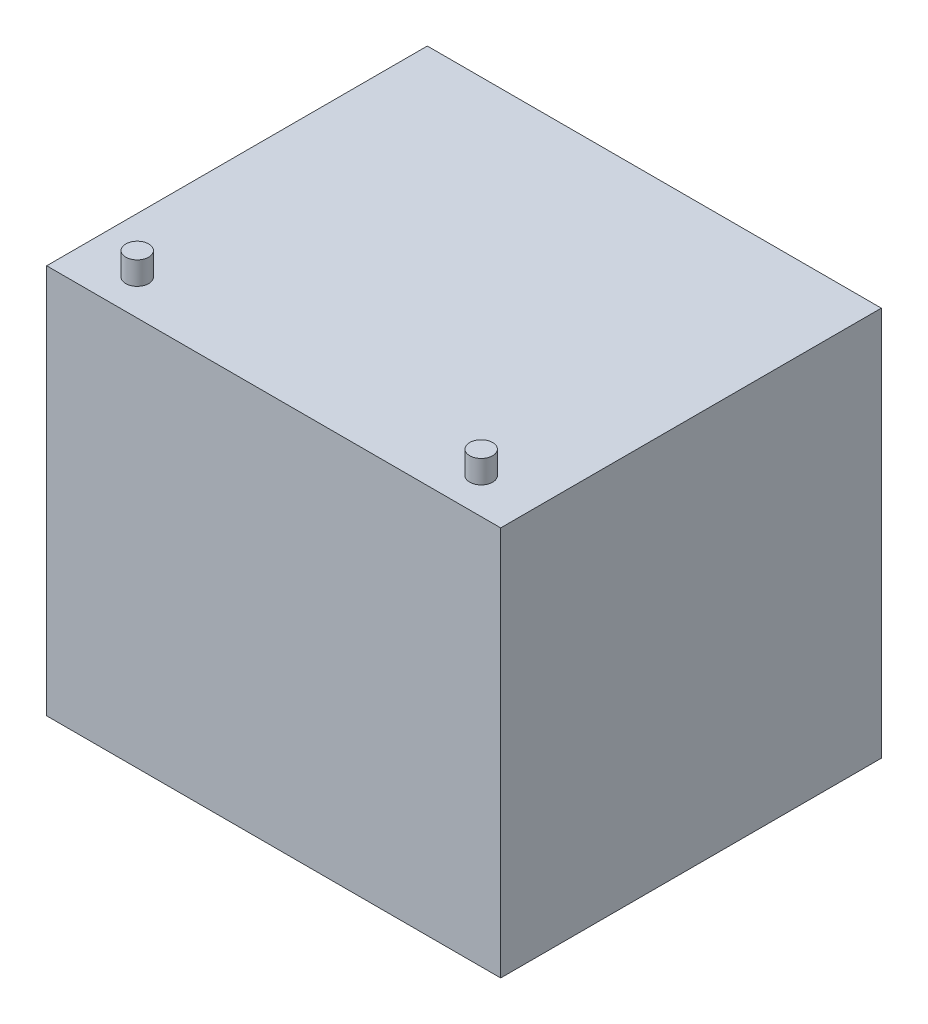
ISO-10303-21;
HEADER;
FILE_DESCRIPTION(('STEP AP214'),'2;1');
FILE_NAME('part.step','',(''),(''),'','','');
FILE_SCHEMA(('AUTOMOTIVE_DESIGN { 1 0 10303 214 1 1 1 1 }'));
ENDSEC;
DATA;
#1=APPLICATION_CONTEXT('core data for automotive mechanical design processes');
#2=APPLICATION_PROTOCOL_DEFINITION('international standard','automotive_design',2000,#1);
#3=PRODUCT_CONTEXT('',#1,'mechanical');
#4=PRODUCT('Part','Part','',(#3));
#5=PRODUCT_RELATED_PRODUCT_CATEGORY('part','',(#4));
#6=PRODUCT_DEFINITION_FORMATION('','',#4);
#7=PRODUCT_DEFINITION_CONTEXT('part definition',#1,'design');
#8=PRODUCT_DEFINITION('design','',#6,#7);
#9=PRODUCT_DEFINITION_SHAPE('','',#8);
#10=(LENGTH_UNIT() NAMED_UNIT(*) SI_UNIT(.MILLI.,.METRE.));
#11=(NAMED_UNIT(*) PLANE_ANGLE_UNIT() SI_UNIT($,.RADIAN.));
#12=(NAMED_UNIT(*) SI_UNIT($,.STERADIAN.) SOLID_ANGLE_UNIT());
#13=UNCERTAINTY_MEASURE_WITH_UNIT(LENGTH_MEASURE(1.E-05),#10,'distance_accuracy_value','');
#14=(GEOMETRIC_REPRESENTATION_CONTEXT(3) GLOBAL_UNCERTAINTY_ASSIGNED_CONTEXT((#13)) GLOBAL_UNIT_ASSIGNED_CONTEXT((#10,
#11,#12)) REPRESENTATION_CONTEXT('',''));
#15=CARTESIAN_POINT('',(0.,0.,0.));
#16=DIRECTION('',(0.,0.,1.));
#17=DIRECTION('',(1.,0.,0.));
#18=AXIS2_PLACEMENT_3D('',#15,#16,#17);
#19=CARTESIAN_POINT('',(99.,170.,-83.));
#20=DIRECTION('',(-1.,0.,0.));
#21=DIRECTION('',(0.,0.,1.));
#22=AXIS2_PLACEMENT_3D('',#19,#20,#21);
#23=PLANE('',#22);
#24=DIRECTION('',(0.,0.,-1.));
#25=VECTOR('',#24,1.);
#26=CARTESIAN_POINT('',(99.,0.,-83.));
#27=LINE('',#26,#25);
#28=CARTESIAN_POINT('',(99.,0.,83.));
#29=VERTEX_POINT('',#28);
#30=CARTESIAN_POINT('',(99.,0.,-83.));
#31=VERTEX_POINT('',#30);
#32=EDGE_CURVE('E103',#29,#31,#27,.T.);
#33=ORIENTED_EDGE('',*,*,#32,.T.);
#34=DIRECTION('',(0.,-1.,0.));
#35=VECTOR('',#34,1.);
#36=CARTESIAN_POINT('',(99.,170.,-83.));
#37=LINE('',#36,#35);
#38=CARTESIAN_POINT('',(99.,170.,-83.));
#39=VERTEX_POINT('',#38);
#40=EDGE_CURVE('E11',#39,#31,#37,.T.);
#41=ORIENTED_EDGE('',*,*,#40,.F.);
#42=DIRECTION('',(0.,0.,-1.));
#43=VECTOR('',#42,1.);
#44=CARTESIAN_POINT('',(99.,170.,-83.));
#45=LINE('',#44,#43);
#46=CARTESIAN_POINT('',(99.,170.,83.));
#47=VERTEX_POINT('',#46);
#48=EDGE_CURVE('E91',#47,#39,#45,.T.);
#49=ORIENTED_EDGE('',*,*,#48,.F.);
#50=DIRECTION('',(0.,-1.,0.));
#51=VECTOR('',#50,1.);
#52=CARTESIAN_POINT('',(99.,170.,83.));
#53=LINE('',#52,#51);
#54=EDGE_CURVE('E99',#47,#29,#53,.T.);
#55=ORIENTED_EDGE('',*,*,#54,.T.);
#56=EDGE_LOOP('',(#33,#41,#49,#55));
#57=FACE_BOUND('',#56,.T.);
#58=ADVANCED_FACE('F40',(#57),#23,.F.);
#59=CARTESIAN_POINT('',(-99.,170.,-83.));
#60=DIRECTION('',(0.,0.,1.));
#61=DIRECTION('',(1.,0.,0.));
#62=AXIS2_PLACEMENT_3D('',#59,#60,#61);
#63=PLANE('',#62);
#64=DIRECTION('',(-1.,0.,0.));
#65=VECTOR('',#64,1.);
#66=CARTESIAN_POINT('',(-99.,0.,-83.));
#67=LINE('',#66,#65);
#68=CARTESIAN_POINT('',(-99.,0.,-83.));
#69=VERTEX_POINT('',#68);
#70=EDGE_CURVE('E95',#31,#69,#67,.T.);
#71=ORIENTED_EDGE('',*,*,#70,.T.);
#72=DIRECTION('',(0.,-1.,0.));
#73=VECTOR('',#72,1.);
#74=CARTESIAN_POINT('',(-99.,170.,-83.));
#75=LINE('',#74,#73);
#76=CARTESIAN_POINT('',(-99.,170.,-83.));
#77=VERTEX_POINT('',#76);
#78=EDGE_CURVE('E48',#77,#69,#75,.T.);
#79=ORIENTED_EDGE('',*,*,#78,.F.);
#80=DIRECTION('',(-1.,0.,0.));
#81=VECTOR('',#80,1.);
#82=CARTESIAN_POINT('',(-99.,170.,-83.));
#83=LINE('',#82,#81);
#84=EDGE_CURVE('E86',#39,#77,#83,.T.);
#85=ORIENTED_EDGE('',*,*,#84,.F.);
#86=ORIENTED_EDGE('',*,*,#40,.T.);
#87=EDGE_LOOP('',(#71,#79,#85,#86));
#88=FACE_BOUND('',#87,.T.);
#89=ADVANCED_FACE('F94',(#88),#63,.F.);
#90=CARTESIAN_POINT('',(-99.,170.,-83.));
#91=DIRECTION('',(1.,0.,0.));
#92=DIRECTION('',(0.,0.,-1.));
#93=AXIS2_PLACEMENT_3D('',#90,#91,#92);
#94=PLANE('',#93);
#95=DIRECTION('',(0.,0.,1.));
#96=VECTOR('',#95,1.);
#97=CARTESIAN_POINT('',(-99.,0.,-83.));
#98=LINE('',#97,#96);
#99=CARTESIAN_POINT('',(-99.,0.,83.));
#100=VERTEX_POINT('',#99);
#101=EDGE_CURVE('E73',#69,#100,#98,.T.);
#102=ORIENTED_EDGE('',*,*,#101,.T.);
#103=DIRECTION('',(0.,-1.,0.));
#104=VECTOR('',#103,1.);
#105=CARTESIAN_POINT('',(-99.,170.,83.));
#106=LINE('',#105,#104);
#107=CARTESIAN_POINT('',(-99.,170.,83.));
#108=VERTEX_POINT('',#107);
#109=EDGE_CURVE('E96',#108,#100,#106,.T.);
#110=ORIENTED_EDGE('',*,*,#109,.F.);
#111=DIRECTION('',(0.,0.,1.));
#112=VECTOR('',#111,1.);
#113=CARTESIAN_POINT('',(-99.,170.,-83.));
#114=LINE('',#113,#112);
#115=EDGE_CURVE('E89',#77,#108,#114,.T.);
#116=ORIENTED_EDGE('',*,*,#115,.F.);
#117=ORIENTED_EDGE('',*,*,#78,.T.);
#118=EDGE_LOOP('',(#102,#110,#116,#117));
#119=FACE_BOUND('',#118,.T.);
#120=ADVANCED_FACE('F97',(#119),#94,.F.);
#121=CARTESIAN_POINT('',(-99.,170.,83.));
#122=DIRECTION('',(0.,0.,-1.));
#123=DIRECTION('',(-1.,0.,0.));
#124=AXIS2_PLACEMENT_3D('',#121,#122,#123);
#125=PLANE('',#124);
#126=DIRECTION('',(1.,0.,0.));
#127=VECTOR('',#126,1.);
#128=CARTESIAN_POINT('',(-99.,0.,83.));
#129=LINE('',#128,#127);
#130=EDGE_CURVE('E79',#100,#29,#129,.T.);
#131=ORIENTED_EDGE('',*,*,#130,.T.);
#132=ORIENTED_EDGE('',*,*,#54,.F.);
#133=DIRECTION('',(1.,0.,0.));
#134=VECTOR('',#133,1.);
#135=CARTESIAN_POINT('',(-99.,170.,83.));
#136=LINE('',#135,#134);
#137=EDGE_CURVE('E56',#108,#47,#136,.T.);
#138=ORIENTED_EDGE('',*,*,#137,.F.);
#139=ORIENTED_EDGE('',*,*,#109,.T.);
#140=EDGE_LOOP('',(#131,#132,#138,#139));
#141=FACE_BOUND('',#140,.T.);
#142=ADVANCED_FACE('F111',(#141),#125,.F.);
#143=CARTESIAN_POINT('',(0.,170.,0.));
#144=DIRECTION('',(0.,1.,0.));
#145=DIRECTION('',(0.,0.,1.));
#146=AXIS2_PLACEMENT_3D('',#143,#144,#145);
#147=PLANE('',#146);
#148=CARTESIAN_POINT('',(75.,170.,67.5));
#149=DIRECTION('',(0.,1.,0.));
#150=DIRECTION('',(0.,0.,1.));
#151=AXIS2_PLACEMENT_3D('',#148,#149,#150);
#152=CIRCLE('',#151,5.00000000000001);
#153=CARTESIAN_POINT('',(75.,170.,72.5));
#154=VERTEX_POINT('',#153);
#155=EDGE_CURVE('E120',#154,#154,#152,.T.);
#156=ORIENTED_EDGE('',*,*,#155,.F.);
#157=EDGE_LOOP('',(#156));
#158=FACE_BOUND('',#157,.T.);
#159=CARTESIAN_POINT('',(-75.,170.,67.5));
#160=DIRECTION('',(0.,1.,0.));
#161=DIRECTION('',(0.,0.,1.));
#162=AXIS2_PLACEMENT_3D('',#159,#160,#161);
#163=CIRCLE('',#162,5.00000000000001);
#164=CARTESIAN_POINT('',(-75.,170.,72.5));
#165=VERTEX_POINT('',#164);
#166=EDGE_CURVE('E117',#165,#165,#163,.T.);
#167=ORIENTED_EDGE('',*,*,#166,.F.);
#168=EDGE_LOOP('',(#167));
#169=FACE_BOUND('',#168,.T.);
#170=ORIENTED_EDGE('',*,*,#48,.T.);
#171=ORIENTED_EDGE('',*,*,#84,.T.);
#172=ORIENTED_EDGE('',*,*,#115,.T.);
#173=ORIENTED_EDGE('',*,*,#137,.T.);
#174=EDGE_LOOP('',(#170,#171,#172,#173));
#175=FACE_BOUND('',#174,.T.);
#176=ADVANCED_FACE('F87',(#158,#169,#175),#147,.T.);
#177=CARTESIAN_POINT('',(0.,0.,0.));
#178=DIRECTION('',(0.,1.,0.));
#179=DIRECTION('',(0.,0.,1.));
#180=AXIS2_PLACEMENT_3D('',#177,#178,#179);
#181=PLANE('',#180);
#182=ORIENTED_EDGE('',*,*,#32,.F.);
#183=ORIENTED_EDGE('',*,*,#130,.F.);
#184=ORIENTED_EDGE('',*,*,#101,.F.);
#185=ORIENTED_EDGE('',*,*,#70,.F.);
#186=EDGE_LOOP('',(#182,#183,#184,#185));
#187=FACE_BOUND('',#186,.T.);
#188=ADVANCED_FACE('F114',(#187),#181,.F.);
#189=CARTESIAN_POINT('',(-75.,180.,67.5));
#190=DIRECTION('',(0.,-1.,0.));
#191=DIRECTION('',(0.,0.,-1.));
#192=AXIS2_PLACEMENT_3D('',#189,#190,#191);
#193=CYLINDRICAL_SURFACE('',#192,5.00000000000001);
#194=CARTESIAN_POINT('',(-75.,180.,67.5));
#195=DIRECTION('',(0.,1.,0.));
#196=DIRECTION('',(0.,0.,1.));
#197=AXIS2_PLACEMENT_3D('',#194,#195,#196);
#198=CIRCLE('',#197,5.00000000000001);
#199=CARTESIAN_POINT('',(-75.,180.,72.5));
#200=VERTEX_POINT('',#199);
#201=EDGE_CURVE('E106',#200,#200,#198,.T.);
#202=ORIENTED_EDGE('',*,*,#201,.F.);
#203=EDGE_LOOP('',(#202));
#204=FACE_BOUND('',#203,.T.);
#205=ORIENTED_EDGE('',*,*,#166,.T.);
#206=EDGE_LOOP('',(#205));
#207=FACE_BOUND('',#206,.T.);
#208=ADVANCED_FACE('F136',(#204,#207),#193,.T.);
#209=CARTESIAN_POINT('',(-75.,180.,67.5));
#210=DIRECTION('',(0.,1.,0.));
#211=DIRECTION('',(0.,0.,1.));
#212=AXIS2_PLACEMENT_3D('',#209,#210,#211);
#213=PLANE('',#212);
#214=ORIENTED_EDGE('',*,*,#201,.T.);
#215=EDGE_LOOP('',(#214));
#216=FACE_BOUND('',#215,.T.);
#217=ADVANCED_FACE('F138',(#216),#213,.T.);
#218=CARTESIAN_POINT('',(75.,180.,67.5));
#219=DIRECTION('',(0.,-1.,0.));
#220=DIRECTION('',(0.,0.,-1.));
#221=AXIS2_PLACEMENT_3D('',#218,#219,#220);
#222=CYLINDRICAL_SURFACE('',#221,5.00000000000001);
#223=CARTESIAN_POINT('',(75.,180.,67.5));
#224=DIRECTION('',(0.,1.,0.));
#225=DIRECTION('',(0.,0.,1.));
#226=AXIS2_PLACEMENT_3D('',#223,#224,#225);
#227=CIRCLE('',#226,5.00000000000001);
#228=CARTESIAN_POINT('',(75.,180.,72.5));
#229=VERTEX_POINT('',#228);
#230=EDGE_CURVE('E123',#229,#229,#227,.T.);
#231=ORIENTED_EDGE('',*,*,#230,.F.);
#232=EDGE_LOOP('',(#231));
#233=FACE_BOUND('',#232,.T.);
#234=ORIENTED_EDGE('',*,*,#155,.T.);
#235=EDGE_LOOP('',(#234));
#236=FACE_BOUND('',#235,.T.);
#237=ADVANCED_FACE('F129',(#233,#236),#222,.T.);
#238=CARTESIAN_POINT('',(75.,180.,67.5));
#239=DIRECTION('',(0.,1.,0.));
#240=DIRECTION('',(0.,0.,1.));
#241=AXIS2_PLACEMENT_3D('',#238,#239,#240);
#242=PLANE('',#241);
#243=ORIENTED_EDGE('',*,*,#230,.T.);
#244=EDGE_LOOP('',(#243));
#245=FACE_BOUND('',#244,.T.);
#246=ADVANCED_FACE('F200',(#245),#242,.T.);
#247=CLOSED_SHELL('',(#58,#89,#120,#142,#176,#188,#208,#217,#237,#246));
#248=MANIFOLD_SOLID_BREP('B2',#247);
#249=ADVANCED_BREP_SHAPE_REPRESENTATION('',(#18,#248),#14);
#250=SHAPE_DEFINITION_REPRESENTATION(#9,#249);
ENDSEC;
END-ISO-10303-21;
